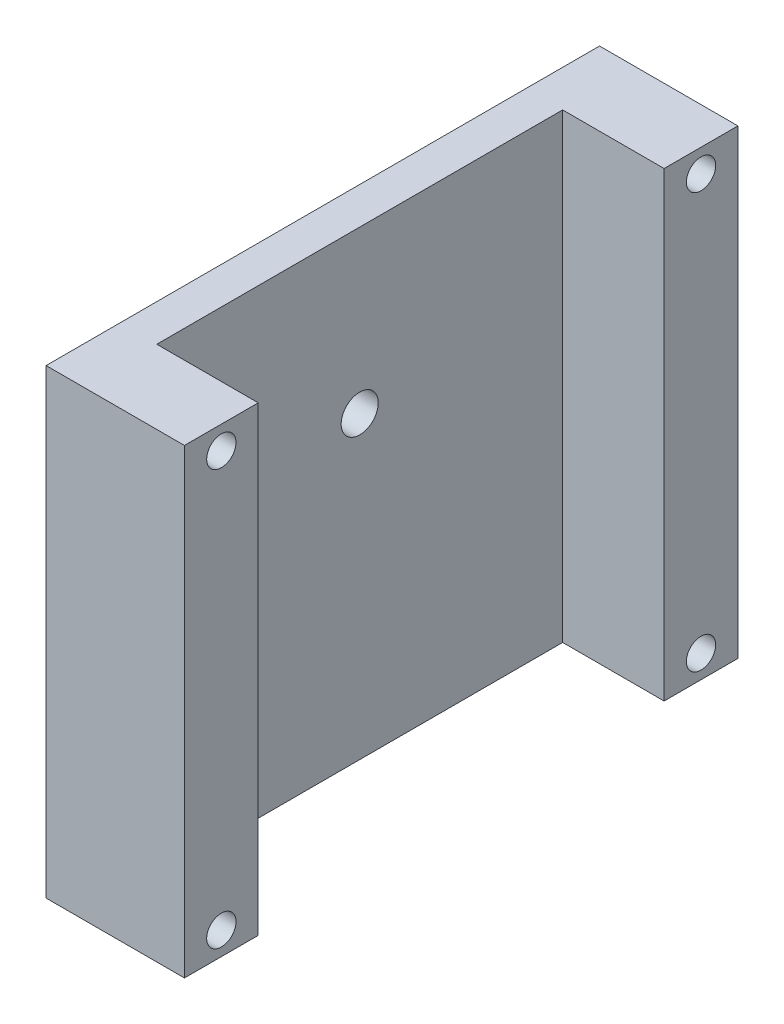
ISO-10303-21;
HEADER;
FILE_DESCRIPTION(('STEP AP214'),'2;1');
FILE_NAME('part.step','',(''),(''),'','','');
FILE_SCHEMA(('AUTOMOTIVE_DESIGN { 1 0 10303 214 1 1 1 1 }'));
ENDSEC;
DATA;
#1=APPLICATION_CONTEXT('core data for automotive mechanical design processes');
#2=APPLICATION_PROTOCOL_DEFINITION('international standard','automotive_design',2000,#1);
#3=PRODUCT_CONTEXT('',#1,'mechanical');
#4=PRODUCT('Part','Part','',(#3));
#5=PRODUCT_RELATED_PRODUCT_CATEGORY('part','',(#4));
#6=PRODUCT_DEFINITION_FORMATION('','',#4);
#7=PRODUCT_DEFINITION_CONTEXT('part definition',#1,'design');
#8=PRODUCT_DEFINITION('design','',#6,#7);
#9=PRODUCT_DEFINITION_SHAPE('','',#8);
#10=(LENGTH_UNIT() NAMED_UNIT(*) SI_UNIT(.MILLI.,.METRE.));
#11=(NAMED_UNIT(*) PLANE_ANGLE_UNIT() SI_UNIT($,.RADIAN.));
#12=(NAMED_UNIT(*) SI_UNIT($,.STERADIAN.) SOLID_ANGLE_UNIT());
#13=UNCERTAINTY_MEASURE_WITH_UNIT(LENGTH_MEASURE(1.E-05),#10,'distance_accuracy_value','');
#14=(GEOMETRIC_REPRESENTATION_CONTEXT(3) GLOBAL_UNCERTAINTY_ASSIGNED_CONTEXT((#13)) GLOBAL_UNIT_ASSIGNED_CONTEXT((#10,
#11,#12)) REPRESENTATION_CONTEXT('',''));
#15=CARTESIAN_POINT('',(0.,0.,0.));
#16=DIRECTION('',(0.,0.,1.));
#17=DIRECTION('',(1.,0.,0.));
#18=AXIS2_PLACEMENT_3D('',#15,#16,#17);
#19=CARTESIAN_POINT('',(19.05,0.,0.));
#20=DIRECTION('',(-1.,0.,0.));
#21=DIRECTION('',(0.,0.,1.));
#22=AXIS2_PLACEMENT_3D('',#19,#20,#21);
#23=PLANE('',#22);
#24=CARTESIAN_POINT('',(19.05,-28.575,-33.02));
#25=DIRECTION('',(1.,0.,0.));
#26=DIRECTION('',(0.,0.,-1.));
#27=AXIS2_PLACEMENT_3D('',#24,#25,#26);
#28=CIRCLE('',#27,2.0193);
#29=CARTESIAN_POINT('',(19.05,-28.575,-35.0393));
#30=VERTEX_POINT('',#29);
#31=EDGE_CURVE('E134',#30,#30,#28,.T.);
#32=ORIENTED_EDGE('',*,*,#31,.F.);
#33=EDGE_LOOP('',(#32));
#34=FACE_BOUND('',#33,.T.);
#35=CARTESIAN_POINT('',(19.05,28.575,-33.02));
#36=DIRECTION('',(1.,0.,0.));
#37=DIRECTION('',(0.,0.,-1.));
#38=AXIS2_PLACEMENT_3D('',#35,#36,#37);
#39=CIRCLE('',#38,2.0193);
#40=CARTESIAN_POINT('',(19.05,28.575,-35.0393));
#41=VERTEX_POINT('',#40);
#42=EDGE_CURVE('E144',#41,#41,#39,.T.);
#43=ORIENTED_EDGE('',*,*,#42,.F.);
#44=EDGE_LOOP('',(#43));
#45=FACE_BOUND('',#44,.T.);
#46=DIRECTION('',(0.,0.,1.));
#47=VECTOR('',#46,1.);
#48=CARTESIAN_POINT('',(19.05,31.75,38.1));
#49=LINE('',#48,#47);
#50=CARTESIAN_POINT('',(19.05,31.75,-38.1));
#51=VERTEX_POINT('',#50);
#52=CARTESIAN_POINT('',(19.05,31.75,-27.94));
#53=VERTEX_POINT('',#52);
#54=EDGE_CURVE('E90',#51,#53,#49,.T.);
#55=ORIENTED_EDGE('',*,*,#54,.T.);
#56=DIRECTION('',(0.,1.,0.));
#57=VECTOR('',#56,1.);
#58=CARTESIAN_POINT('',(19.05,-31.75,-27.94));
#59=LINE('',#58,#57);
#60=CARTESIAN_POINT('',(19.05,-31.75,-27.94));
#61=VERTEX_POINT('',#60);
#62=EDGE_CURVE('E162',#61,#53,#59,.T.);
#63=ORIENTED_EDGE('',*,*,#62,.F.);
#64=DIRECTION('',(0.,0.,-1.));
#65=VECTOR('',#64,1.);
#66=CARTESIAN_POINT('',(19.05,-31.75,38.1));
#67=LINE('',#66,#65);
#68=CARTESIAN_POINT('',(19.05,-31.75,-38.1));
#69=VERTEX_POINT('',#68);
#70=EDGE_CURVE('E61',#61,#69,#67,.T.);
#71=ORIENTED_EDGE('',*,*,#70,.T.);
#72=DIRECTION('',(0.,1.,0.));
#73=VECTOR('',#72,1.);
#74=CARTESIAN_POINT('',(19.05,-31.75,-38.1));
#75=LINE('',#74,#73);
#76=EDGE_CURVE('E187',#69,#51,#75,.T.);
#77=ORIENTED_EDGE('',*,*,#76,.T.);
#78=EDGE_LOOP('',(#55,#63,#71,#77));
#79=FACE_BOUND('',#78,.T.);
#80=ADVANCED_FACE('F37',(#34,#45,#79),#23,.F.);
#81=CARTESIAN_POINT('',(19.05,-31.75,-38.1));
#82=DIRECTION('',(0.,0.,1.));
#83=DIRECTION('',(1.,0.,0.));
#84=AXIS2_PLACEMENT_3D('',#81,#82,#83);
#85=PLANE('',#84);
#86=DIRECTION('',(0.,1.,0.));
#87=VECTOR('',#86,1.);
#88=CARTESIAN_POINT('',(0.,-31.75,-38.1));
#89=LINE('',#88,#87);
#90=CARTESIAN_POINT('',(0.,-31.75,-38.1));
#91=VERTEX_POINT('',#90);
#92=CARTESIAN_POINT('',(0.,31.75,-38.1));
#93=VERTEX_POINT('',#92);
#94=EDGE_CURVE('E181',#91,#93,#89,.T.);
#95=ORIENTED_EDGE('',*,*,#94,.T.);
#96=DIRECTION('',(-1.,0.,0.));
#97=VECTOR('',#96,1.);
#98=CARTESIAN_POINT('',(19.05,31.75,-38.1));
#99=LINE('',#98,#97);
#100=EDGE_CURVE('E11',#51,#93,#99,.T.);
#101=ORIENTED_EDGE('',*,*,#100,.F.);
#102=ORIENTED_EDGE('',*,*,#76,.F.);
#103=DIRECTION('',(-1.,0.,0.));
#104=VECTOR('',#103,1.);
#105=CARTESIAN_POINT('',(19.05,-31.75,-38.1));
#106=LINE('',#105,#104);
#107=EDGE_CURVE('E196',#69,#91,#106,.T.);
#108=ORIENTED_EDGE('',*,*,#107,.T.);
#109=EDGE_LOOP('',(#95,#101,#102,#108));
#110=FACE_BOUND('',#109,.T.);
#111=ADVANCED_FACE('F39',(#110),#85,.F.);
#112=CARTESIAN_POINT('',(19.05,31.75,38.1));
#113=DIRECTION('',(0.,-1.,0.));
#114=DIRECTION('',(0.,0.,-1.));
#115=AXIS2_PLACEMENT_3D('',#112,#113,#114);
#116=PLANE('',#115);
#117=DIRECTION('',(0.,0.,1.));
#118=VECTOR('',#117,1.);
#119=CARTESIAN_POINT('',(5.08,31.75,27.94));
#120=LINE('',#119,#118);
#121=CARTESIAN_POINT('',(5.08,31.75,-27.94));
#122=VERTEX_POINT('',#121);
#123=CARTESIAN_POINT('',(5.08,31.75,27.94));
#124=VERTEX_POINT('',#123);
#125=EDGE_CURVE('E166',#122,#124,#120,.T.);
#126=ORIENTED_EDGE('',*,*,#125,.F.);
#127=DIRECTION('',(1.,0.,0.));
#128=VECTOR('',#127,1.);
#129=CARTESIAN_POINT('',(5.08,31.75,-27.94));
#130=LINE('',#129,#128);
#131=EDGE_CURVE('E176',#122,#53,#130,.T.);
#132=ORIENTED_EDGE('',*,*,#131,.T.);
#133=ORIENTED_EDGE('',*,*,#54,.F.);
#134=ORIENTED_EDGE('',*,*,#100,.T.);
#135=DIRECTION('',(0.,0.,1.));
#136=VECTOR('',#135,1.);
#137=CARTESIAN_POINT('',(0.,31.75,38.1));
#138=LINE('',#137,#136);
#139=CARTESIAN_POINT('',(0.,31.75,38.1));
#140=VERTEX_POINT('',#139);
#141=EDGE_CURVE('E199',#93,#140,#138,.T.);
#142=ORIENTED_EDGE('',*,*,#141,.T.);
#143=DIRECTION('',(-1.,0.,0.));
#144=VECTOR('',#143,1.);
#145=CARTESIAN_POINT('',(19.05,31.75,38.1));
#146=LINE('',#145,#144);
#147=CARTESIAN_POINT('',(19.05,31.75,38.1));
#148=VERTEX_POINT('',#147);
#149=EDGE_CURVE('E45',#148,#140,#146,.T.);
#150=ORIENTED_EDGE('',*,*,#149,.F.);
#151=CARTESIAN_POINT('',(19.05,31.75,27.94));
#152=VERTEX_POINT('',#151);
#153=EDGE_CURVE('E189',#152,#148,#49,.T.);
#154=ORIENTED_EDGE('',*,*,#153,.F.);
#155=DIRECTION('',(1.,0.,0.));
#156=VECTOR('',#155,1.);
#157=CARTESIAN_POINT('',(5.08,31.75,27.94));
#158=LINE('',#157,#156);
#159=EDGE_CURVE('E52',#124,#152,#158,.T.);
#160=ORIENTED_EDGE('',*,*,#159,.F.);
#161=EDGE_LOOP('',(#126,#132,#133,#134,#142,#150,#154,#160));
#162=FACE_BOUND('',#161,.T.);
#163=ADVANCED_FACE('F232',(#162),#116,.F.);
#164=CARTESIAN_POINT('',(19.05,-31.75,38.1));
#165=DIRECTION('',(0.,0.,-1.));
#166=DIRECTION('',(-1.,0.,0.));
#167=AXIS2_PLACEMENT_3D('',#164,#165,#166);
#168=PLANE('',#167);
#169=DIRECTION('',(0.,-1.,0.));
#170=VECTOR('',#169,1.);
#171=CARTESIAN_POINT('',(0.,-31.75,38.1));
#172=LINE('',#171,#170);
#173=CARTESIAN_POINT('',(0.,-31.75,38.1));
#174=VERTEX_POINT('',#173);
#175=EDGE_CURVE('E201',#140,#174,#172,.T.);
#176=ORIENTED_EDGE('',*,*,#175,.T.);
#177=DIRECTION('',(-1.,0.,0.));
#178=VECTOR('',#177,1.);
#179=CARTESIAN_POINT('',(19.05,-31.75,38.1));
#180=LINE('',#179,#178);
#181=CARTESIAN_POINT('',(19.05,-31.75,38.1));
#182=VERTEX_POINT('',#181);
#183=EDGE_CURVE('E205',#182,#174,#180,.T.);
#184=ORIENTED_EDGE('',*,*,#183,.F.);
#185=DIRECTION('',(0.,-1.,0.));
#186=VECTOR('',#185,1.);
#187=CARTESIAN_POINT('',(19.05,-31.75,38.1));
#188=LINE('',#187,#186);
#189=EDGE_CURVE('E191',#148,#182,#188,.T.);
#190=ORIENTED_EDGE('',*,*,#189,.F.);
#191=ORIENTED_EDGE('',*,*,#149,.T.);
#192=EDGE_LOOP('',(#176,#184,#190,#191));
#193=FACE_BOUND('',#192,.T.);
#194=ADVANCED_FACE('F211',(#193),#168,.F.);
#195=CARTESIAN_POINT('',(19.05,-31.75,38.1));
#196=DIRECTION('',(0.,1.,0.));
#197=DIRECTION('',(0.,0.,1.));
#198=AXIS2_PLACEMENT_3D('',#195,#196,#197);
#199=PLANE('',#198);
#200=ORIENTED_EDGE('',*,*,#70,.F.);
#201=DIRECTION('',(1.,0.,0.));
#202=VECTOR('',#201,1.);
#203=CARTESIAN_POINT('',(5.08,-31.75,-27.94));
#204=LINE('',#203,#202);
#205=CARTESIAN_POINT('',(5.08,-31.75,-27.94));
#206=VERTEX_POINT('',#205);
#207=EDGE_CURVE('E179',#206,#61,#204,.T.);
#208=ORIENTED_EDGE('',*,*,#207,.F.);
#209=DIRECTION('',(0.,0.,-1.));
#210=VECTOR('',#209,1.);
#211=CARTESIAN_POINT('',(5.08,-31.75,27.94));
#212=LINE('',#211,#210);
#213=CARTESIAN_POINT('',(5.08,-31.75,27.94));
#214=VERTEX_POINT('',#213);
#215=EDGE_CURVE('E173',#214,#206,#212,.T.);
#216=ORIENTED_EDGE('',*,*,#215,.F.);
#217=DIRECTION('',(1.,0.,0.));
#218=VECTOR('',#217,1.);
#219=CARTESIAN_POINT('',(5.08,-31.75,27.94));
#220=LINE('',#219,#218);
#221=CARTESIAN_POINT('',(19.05,-31.75,27.94));
#222=VERTEX_POINT('',#221);
#223=EDGE_CURVE('E182',#214,#222,#220,.T.);
#224=ORIENTED_EDGE('',*,*,#223,.T.);
#225=EDGE_CURVE('E193',#182,#222,#67,.T.);
#226=ORIENTED_EDGE('',*,*,#225,.F.);
#227=ORIENTED_EDGE('',*,*,#183,.T.);
#228=DIRECTION('',(0.,0.,-1.));
#229=VECTOR('',#228,1.);
#230=CARTESIAN_POINT('',(0.,-31.75,38.1));
#231=LINE('',#230,#229);
#232=EDGE_CURVE('E83',#174,#91,#231,.T.);
#233=ORIENTED_EDGE('',*,*,#232,.T.);
#234=ORIENTED_EDGE('',*,*,#107,.F.);
#235=EDGE_LOOP('',(#200,#208,#216,#224,#226,#227,#233,#234));
#236=FACE_BOUND('',#235,.T.);
#237=ADVANCED_FACE('F220',(#236),#199,.F.);
#238=CARTESIAN_POINT('',(19.05,-28.575,33.02));
#239=DIRECTION('',(1.,0.,0.));
#240=DIRECTION('',(0.,0.,-1.));
#241=AXIS2_PLACEMENT_3D('',#238,#239,#240);
#242=CIRCLE('',#241,2.0193);
#243=CARTESIAN_POINT('',(19.05,-28.575,31.0007));
#244=VERTEX_POINT('',#243);
#245=EDGE_CURVE('E133',#244,#244,#242,.T.);
#246=ORIENTED_EDGE('',*,*,#245,.F.);
#247=EDGE_LOOP('',(#246));
#248=FACE_BOUND('',#247,.T.);
#249=CARTESIAN_POINT('',(19.05,28.575,33.02));
#250=DIRECTION('',(1.,0.,0.));
#251=DIRECTION('',(0.,0.,-1.));
#252=AXIS2_PLACEMENT_3D('',#249,#250,#251);
#253=CIRCLE('',#252,2.0193);
#254=CARTESIAN_POINT('',(19.05,28.575,31.0007));
#255=VERTEX_POINT('',#254);
#256=EDGE_CURVE('E156',#255,#255,#253,.T.);
#257=ORIENTED_EDGE('',*,*,#256,.F.);
#258=EDGE_LOOP('',(#257));
#259=FACE_BOUND('',#258,.T.);
#260=ORIENTED_EDGE('',*,*,#225,.T.);
#261=DIRECTION('',(0.,-1.,0.));
#262=VECTOR('',#261,1.);
#263=CARTESIAN_POINT('',(19.05,-31.75,27.94));
#264=LINE('',#263,#262);
#265=EDGE_CURVE('E167',#152,#222,#264,.T.);
#266=ORIENTED_EDGE('',*,*,#265,.F.);
#267=ORIENTED_EDGE('',*,*,#153,.T.);
#268=ORIENTED_EDGE('',*,*,#189,.T.);
#269=EDGE_LOOP('',(#260,#266,#267,#268));
#270=FACE_BOUND('',#269,.T.);
#271=ADVANCED_FACE('F228',(#248,#259,#270),#23,.F.);
#272=CARTESIAN_POINT('',(0.,0.,0.));
#273=DIRECTION('',(-1.,0.,0.));
#274=DIRECTION('',(0.,0.,1.));
#275=AXIS2_PLACEMENT_3D('',#272,#273,#274);
#276=PLANE('',#275);
#277=CARTESIAN_POINT('',(0.,9.525,0.));
#278=DIRECTION('',(-1.,0.,0.));
#279=DIRECTION('',(0.,0.,1.));
#280=AXIS2_PLACEMENT_3D('',#277,#278,#279);
#281=CIRCLE('',#280,2.55269999999999);
#282=CARTESIAN_POINT('',(0.,9.525,2.55269999999999));
#283=VERTEX_POINT('',#282);
#284=EDGE_CURVE('E153',#283,#283,#281,.T.);
#285=ORIENTED_EDGE('',*,*,#284,.F.);
#286=EDGE_LOOP('',(#285));
#287=FACE_BOUND('',#286,.T.);
#288=ORIENTED_EDGE('',*,*,#94,.F.);
#289=ORIENTED_EDGE('',*,*,#232,.F.);
#290=ORIENTED_EDGE('',*,*,#175,.F.);
#291=ORIENTED_EDGE('',*,*,#141,.F.);
#292=EDGE_LOOP('',(#288,#289,#290,#291));
#293=FACE_BOUND('',#292,.T.);
#294=ADVANCED_FACE('F216',(#287,#293),#276,.T.);
#295=CARTESIAN_POINT('',(5.08,-31.75,-27.94));
#296=DIRECTION('',(0.,0.,-1.));
#297=DIRECTION('',(-1.,0.,0.));
#298=AXIS2_PLACEMENT_3D('',#295,#296,#297);
#299=PLANE('',#298);
#300=ORIENTED_EDGE('',*,*,#62,.T.);
#301=ORIENTED_EDGE('',*,*,#131,.F.);
#302=DIRECTION('',(0.,1.,0.));
#303=VECTOR('',#302,1.);
#304=CARTESIAN_POINT('',(5.08,-31.75,-27.94));
#305=LINE('',#304,#303);
#306=EDGE_CURVE('E163',#206,#122,#305,.T.);
#307=ORIENTED_EDGE('',*,*,#306,.F.);
#308=ORIENTED_EDGE('',*,*,#207,.T.);
#309=EDGE_LOOP('',(#300,#301,#307,#308));
#310=FACE_BOUND('',#309,.T.);
#311=ADVANCED_FACE('F224',(#310),#299,.F.);
#312=CARTESIAN_POINT('',(5.08,-31.75,27.94));
#313=DIRECTION('',(0.,0.,1.));
#314=DIRECTION('',(1.,0.,0.));
#315=AXIS2_PLACEMENT_3D('',#312,#313,#314);
#316=PLANE('',#315);
#317=ORIENTED_EDGE('',*,*,#265,.T.);
#318=ORIENTED_EDGE('',*,*,#223,.F.);
#319=DIRECTION('',(0.,-1.,0.));
#320=VECTOR('',#319,1.);
#321=CARTESIAN_POINT('',(5.08,-31.75,27.94));
#322=LINE('',#321,#320);
#323=EDGE_CURVE('E170',#124,#214,#322,.T.);
#324=ORIENTED_EDGE('',*,*,#323,.F.);
#325=ORIENTED_EDGE('',*,*,#159,.T.);
#326=EDGE_LOOP('',(#317,#318,#324,#325));
#327=FACE_BOUND('',#326,.T.);
#328=ADVANCED_FACE('F250',(#327),#316,.F.);
#329=CARTESIAN_POINT('',(5.08,0.,0.));
#330=DIRECTION('',(-1.,0.,0.));
#331=DIRECTION('',(0.,0.,1.));
#332=AXIS2_PLACEMENT_3D('',#329,#330,#331);
#333=PLANE('',#332);
#334=CARTESIAN_POINT('',(5.08,9.525,0.));
#335=DIRECTION('',(1.,0.,0.));
#336=DIRECTION('',(0.,0.,-1.));
#337=AXIS2_PLACEMENT_3D('',#334,#335,#336);
#338=CIRCLE('',#337,2.55269999999999);
#339=CARTESIAN_POINT('',(5.08,9.525,-2.55269999999999));
#340=VERTEX_POINT('',#339);
#341=EDGE_CURVE('E150',#340,#340,#338,.T.);
#342=ORIENTED_EDGE('',*,*,#341,.F.);
#343=EDGE_LOOP('',(#342));
#344=FACE_BOUND('',#343,.T.);
#345=ORIENTED_EDGE('',*,*,#306,.T.);
#346=ORIENTED_EDGE('',*,*,#125,.T.);
#347=ORIENTED_EDGE('',*,*,#323,.T.);
#348=ORIENTED_EDGE('',*,*,#215,.T.);
#349=EDGE_LOOP('',(#345,#346,#347,#348));
#350=FACE_BOUND('',#349,.T.);
#351=ADVANCED_FACE('F252',(#344,#350),#333,.F.);
#352=CARTESIAN_POINT('',(5.334,28.575,33.02));
#353=DIRECTION('',(1.,0.,0.));
#354=DIRECTION('',(0.,0.,-1.));
#355=AXIS2_PLACEMENT_3D('',#352,#353,#354);
#356=CONICAL_SURFACE('',#355,2.0193,1.02974425867665);
#357=CARTESIAN_POINT('',(4.12068215199765,28.575,33.02));
#358=VERTEX_POINT('',#357);
#359=VERTEX_LOOP('',#358);
#360=FACE_BOUND('',#359,.T.);
#361=CARTESIAN_POINT('',(5.334,28.575,33.02));
#362=DIRECTION('',(1.,0.,0.));
#363=DIRECTION('',(0.,0.,-1.));
#364=AXIS2_PLACEMENT_3D('',#361,#362,#363);
#365=CIRCLE('',#364,2.0193);
#366=CARTESIAN_POINT('',(5.334,28.575,31.0007));
#367=VERTEX_POINT('',#366);
#368=EDGE_CURVE('E159',#367,#367,#365,.T.);
#369=ORIENTED_EDGE('',*,*,#368,.T.);
#370=EDGE_LOOP('',(#369));
#371=FACE_BOUND('',#370,.T.);
#372=ADVANCED_FACE('F292',(#360,#371),#356,.F.);
#373=CARTESIAN_POINT('',(19.05,28.575,33.02));
#374=DIRECTION('',(1.,0.,0.));
#375=DIRECTION('',(0.,0.,-1.));
#376=AXIS2_PLACEMENT_3D('',#373,#374,#375);
#377=CYLINDRICAL_SURFACE('',#376,2.0193);
#378=ORIENTED_EDGE('',*,*,#368,.F.);
#379=EDGE_LOOP('',(#378));
#380=FACE_BOUND('',#379,.T.);
#381=ORIENTED_EDGE('',*,*,#256,.T.);
#382=EDGE_LOOP('',(#381));
#383=FACE_BOUND('',#382,.T.);
#384=ADVANCED_FACE('F297',(#380,#383),#377,.F.);
#385=CARTESIAN_POINT('',(5.08,9.525,0.));
#386=DIRECTION('',(1.,0.,0.));
#387=DIRECTION('',(0.,0.,-1.));
#388=AXIS2_PLACEMENT_3D('',#385,#386,#387);
#389=CYLINDRICAL_SURFACE('',#388,2.55269999999999);
#390=ORIENTED_EDGE('',*,*,#284,.T.);
#391=EDGE_LOOP('',(#390));
#392=FACE_BOUND('',#391,.T.);
#393=ORIENTED_EDGE('',*,*,#341,.T.);
#394=EDGE_LOOP('',(#393));
#395=FACE_BOUND('',#394,.T.);
#396=ADVANCED_FACE('F308',(#392,#395),#389,.F.);
#397=CARTESIAN_POINT('',(5.334,28.575,-33.02));
#398=DIRECTION('',(1.,0.,0.));
#399=DIRECTION('',(0.,0.,-1.));
#400=AXIS2_PLACEMENT_3D('',#397,#398,#399);
#401=CONICAL_SURFACE('',#400,2.0193,1.02974425867665);
#402=CARTESIAN_POINT('',(4.12068215199765,28.575,-33.02));
#403=VERTEX_POINT('',#402);
#404=VERTEX_LOOP('',#403);
#405=FACE_BOUND('',#404,.T.);
#406=CARTESIAN_POINT('',(5.334,28.575,-33.02));
#407=DIRECTION('',(1.,0.,0.));
#408=DIRECTION('',(0.,0.,-1.));
#409=AXIS2_PLACEMENT_3D('',#406,#407,#408);
#410=CIRCLE('',#409,2.0193);
#411=CARTESIAN_POINT('',(5.334,28.575,-35.0393));
#412=VERTEX_POINT('',#411);
#413=EDGE_CURVE('E147',#412,#412,#410,.T.);
#414=ORIENTED_EDGE('',*,*,#413,.T.);
#415=EDGE_LOOP('',(#414));
#416=FACE_BOUND('',#415,.T.);
#417=ADVANCED_FACE('F333',(#405,#416),#401,.F.);
#418=CARTESIAN_POINT('',(19.05,28.575,-33.02));
#419=DIRECTION('',(1.,0.,0.));
#420=DIRECTION('',(0.,0.,-1.));
#421=AXIS2_PLACEMENT_3D('',#418,#419,#420);
#422=CYLINDRICAL_SURFACE('',#421,2.0193);
#423=ORIENTED_EDGE('',*,*,#413,.F.);
#424=EDGE_LOOP('',(#423));
#425=FACE_BOUND('',#424,.T.);
#426=ORIENTED_EDGE('',*,*,#42,.T.);
#427=EDGE_LOOP('',(#426));
#428=FACE_BOUND('',#427,.T.);
#429=ADVANCED_FACE('F351',(#425,#428),#422,.F.);
#430=CARTESIAN_POINT('',(5.334,-28.575,33.02));
#431=DIRECTION('',(1.,0.,0.));
#432=DIRECTION('',(0.,0.,-1.));
#433=AXIS2_PLACEMENT_3D('',#430,#431,#432);
#434=CONICAL_SURFACE('',#433,2.0193,1.02974425867665);
#435=CARTESIAN_POINT('',(4.12068215199765,-28.575,33.02));
#436=VERTEX_POINT('',#435);
#437=VERTEX_LOOP('',#436);
#438=FACE_BOUND('',#437,.T.);
#439=CARTESIAN_POINT('',(5.334,-28.575,33.02));
#440=DIRECTION('',(1.,0.,0.));
#441=DIRECTION('',(0.,0.,-1.));
#442=AXIS2_PLACEMENT_3D('',#439,#440,#441);
#443=CIRCLE('',#442,2.0193);
#444=CARTESIAN_POINT('',(5.334,-28.575,31.0007));
#445=VERTEX_POINT('',#444);
#446=EDGE_CURVE('E137',#445,#445,#443,.T.);
#447=ORIENTED_EDGE('',*,*,#446,.T.);
#448=EDGE_LOOP('',(#447));
#449=FACE_BOUND('',#448,.T.);
#450=ADVANCED_FACE('F362',(#438,#449),#434,.F.);
#451=CARTESIAN_POINT('',(19.05,-28.575,33.02));
#452=DIRECTION('',(1.,0.,0.));
#453=DIRECTION('',(0.,0.,-1.));
#454=AXIS2_PLACEMENT_3D('',#451,#452,#453);
#455=CYLINDRICAL_SURFACE('',#454,2.0193);
#456=ORIENTED_EDGE('',*,*,#446,.F.);
#457=EDGE_LOOP('',(#456));
#458=FACE_BOUND('',#457,.T.);
#459=ORIENTED_EDGE('',*,*,#245,.T.);
#460=EDGE_LOOP('',(#459));
#461=FACE_BOUND('',#460,.T.);
#462=ADVANCED_FACE('F127',(#458,#461),#455,.F.);
#463=CARTESIAN_POINT('',(5.334,-28.575,-33.02));
#464=DIRECTION('',(1.,0.,0.));
#465=DIRECTION('',(0.,0.,-1.));
#466=AXIS2_PLACEMENT_3D('',#463,#464,#465);
#467=CONICAL_SURFACE('',#466,2.0193,1.02974425867665);
#468=CARTESIAN_POINT('',(4.12068215199765,-28.575,-33.02));
#469=VERTEX_POINT('',#468);
#470=VERTEX_LOOP('',#469);
#471=FACE_BOUND('',#470,.T.);
#472=CARTESIAN_POINT('',(5.334,-28.575,-33.02));
#473=DIRECTION('',(1.,0.,0.));
#474=DIRECTION('',(0.,0.,-1.));
#475=AXIS2_PLACEMENT_3D('',#472,#473,#474);
#476=CIRCLE('',#475,2.0193);
#477=CARTESIAN_POINT('',(5.334,-28.575,-35.0393));
#478=VERTEX_POINT('',#477);
#479=EDGE_CURVE('E131',#478,#478,#476,.T.);
#480=ORIENTED_EDGE('',*,*,#479,.T.);
#481=EDGE_LOOP('',(#480));
#482=FACE_BOUND('',#481,.T.);
#483=ADVANCED_FACE('F123',(#471,#482),#467,.F.);
#484=CARTESIAN_POINT('',(19.05,-28.575,-33.02));
#485=DIRECTION('',(1.,0.,0.));
#486=DIRECTION('',(0.,0.,-1.));
#487=AXIS2_PLACEMENT_3D('',#484,#485,#486);
#488=CYLINDRICAL_SURFACE('',#487,2.0193);
#489=ORIENTED_EDGE('',*,*,#479,.F.);
#490=EDGE_LOOP('',(#489));
#491=FACE_BOUND('',#490,.T.);
#492=ORIENTED_EDGE('',*,*,#31,.T.);
#493=EDGE_LOOP('',(#492));
#494=FACE_BOUND('',#493,.T.);
#495=ADVANCED_FACE('F126',(#491,#494),#488,.F.);
#496=CLOSED_SHELL('',(#80,#111,#163,#194,#237,#271,#294,#311,#328,#351,#372,#384,#396,#417,#429,
#450,#462,#483,#495));
#497=MANIFOLD_SOLID_BREP('B2',#496);
#498=ADVANCED_BREP_SHAPE_REPRESENTATION('',(#18,#497),#14);
#499=SHAPE_DEFINITION_REPRESENTATION(#9,#498);
ENDSEC;
END-ISO-10303-21;
